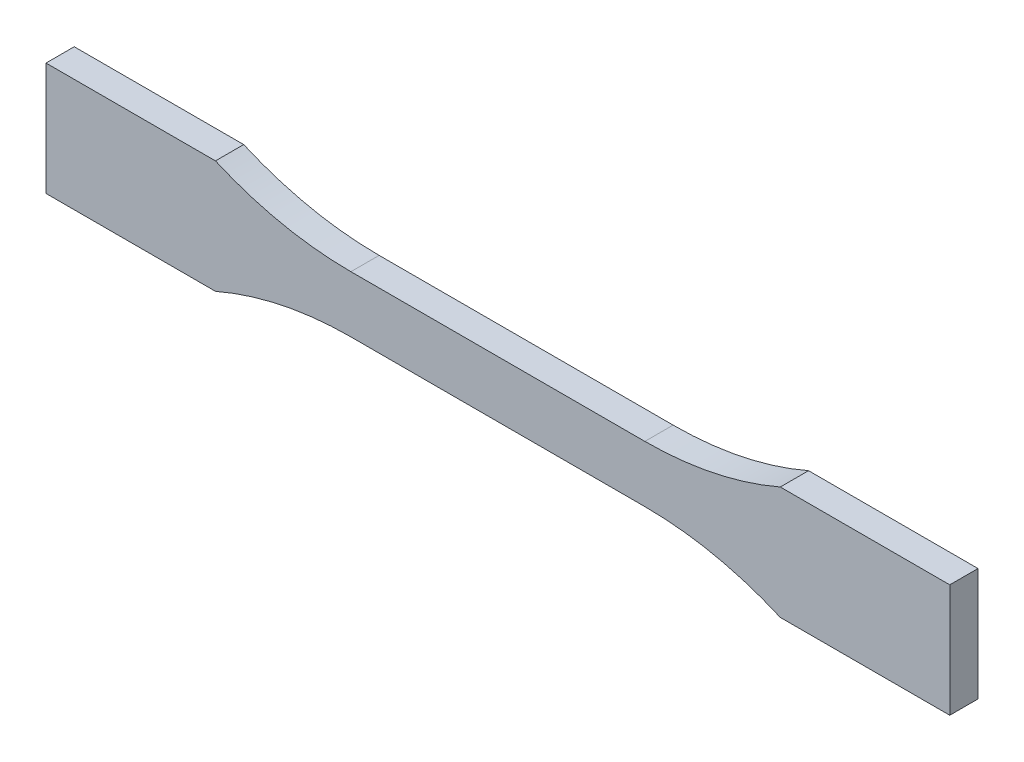
ISO-10303-21;
HEADER;
FILE_DESCRIPTION(('STEP AP214'),'2;1');
FILE_NAME('part.step','',(''),(''),'','','');
FILE_SCHEMA(('AUTOMOTIVE_DESIGN { 1 0 10303 214 1 1 1 1 }'));
ENDSEC;
DATA;
#1=APPLICATION_CONTEXT('core data for automotive mechanical design processes');
#2=APPLICATION_PROTOCOL_DEFINITION('international standard','automotive_design',2000,#1);
#3=PRODUCT_CONTEXT('',#1,'mechanical');
#4=PRODUCT('Part','Part','',(#3));
#5=PRODUCT_RELATED_PRODUCT_CATEGORY('part','',(#4));
#6=PRODUCT_DEFINITION_FORMATION('','',#4);
#7=PRODUCT_DEFINITION_CONTEXT('part definition',#1,'design');
#8=PRODUCT_DEFINITION('design','',#6,#7);
#9=PRODUCT_DEFINITION_SHAPE('','',#8);
#10=(LENGTH_UNIT() NAMED_UNIT(*) SI_UNIT(.MILLI.,.METRE.));
#11=(NAMED_UNIT(*) PLANE_ANGLE_UNIT() SI_UNIT($,.RADIAN.));
#12=(NAMED_UNIT(*) SI_UNIT($,.STERADIAN.) SOLID_ANGLE_UNIT());
#13=UNCERTAINTY_MEASURE_WITH_UNIT(LENGTH_MEASURE(1.E-05),#10,'distance_accuracy_value','');
#14=(GEOMETRIC_REPRESENTATION_CONTEXT(3) GLOBAL_UNCERTAINTY_ASSIGNED_CONTEXT((#13)) GLOBAL_UNIT_ASSIGNED_CONTEXT((#10,
#11,#12)) REPRESENTATION_CONTEXT('',''));
#15=CARTESIAN_POINT('',(0.,0.,0.));
#16=DIRECTION('',(0.,0.,1.));
#17=DIRECTION('',(1.,0.,0.));
#18=AXIS2_PLACEMENT_3D('',#15,#16,#17);
#19=CARTESIAN_POINT('',(-63.5,12.7,3.175));
#20=DIRECTION('',(0.,-1.,0.));
#21=DIRECTION('',(1.,0.,0.));
#22=AXIS2_PLACEMENT_3D('',#19,#20,#21);
#23=PLANE('',#22);
#24=DIRECTION('',(-1.,0.,0.));
#25=VECTOR('',#24,1.);
#26=CARTESIAN_POINT('',(-63.5,12.7,-3.175));
#27=LINE('',#26,#25);
#28=CARTESIAN_POINT('',(-63.5,12.7,-3.175));
#29=VERTEX_POINT('',#28);
#30=CARTESIAN_POINT('',(-101.6,12.7,-3.175));
#31=VERTEX_POINT('',#30);
#32=EDGE_CURVE('E170',#29,#31,#27,.T.);
#33=ORIENTED_EDGE('',*,*,#32,.T.);
#34=DIRECTION('',(0.,0.,-1.));
#35=VECTOR('',#34,1.);
#36=CARTESIAN_POINT('',(-101.6,12.7,3.175));
#37=LINE('',#36,#35);
#38=CARTESIAN_POINT('',(-101.6,12.7,3.175));
#39=VERTEX_POINT('',#38);
#40=EDGE_CURVE('E136',#39,#31,#37,.T.);
#41=ORIENTED_EDGE('',*,*,#40,.F.);
#42=DIRECTION('',(-1.,0.,0.));
#43=VECTOR('',#42,1.);
#44=CARTESIAN_POINT('',(-63.5,12.7,3.175));
#45=LINE('',#44,#43);
#46=CARTESIAN_POINT('',(-63.5,12.7,3.175));
#47=VERTEX_POINT('',#46);
#48=EDGE_CURVE('E127',#47,#39,#45,.T.);
#49=ORIENTED_EDGE('',*,*,#48,.F.);
#50=DIRECTION('',(0.,0.,-1.));
#51=VECTOR('',#50,1.);
#52=CARTESIAN_POINT('',(-63.5,12.7,3.175));
#53=LINE('',#52,#51);
#54=EDGE_CURVE('E134',#47,#29,#53,.T.);
#55=ORIENTED_EDGE('',*,*,#54,.T.);
#56=EDGE_LOOP('',(#33,#41,#49,#55));
#57=FACE_BOUND('',#56,.T.);
#58=ADVANCED_FACE('F38',(#57),#23,.F.);
#59=CARTESIAN_POINT('',(-101.6,12.7,3.175));
#60=DIRECTION('',(1.,0.,0.));
#61=DIRECTION('',(0.,0.,-1.));
#62=AXIS2_PLACEMENT_3D('',#59,#60,#61);
#63=PLANE('',#62);
#64=DIRECTION('',(0.,-1.,0.));
#65=VECTOR('',#64,1.);
#66=CARTESIAN_POINT('',(-101.6,12.7,-3.175));
#67=LINE('',#66,#65);
#68=CARTESIAN_POINT('',(-101.6,-12.7,-3.175));
#69=VERTEX_POINT('',#68);
#70=EDGE_CURVE('E205',#31,#69,#67,.T.);
#71=ORIENTED_EDGE('',*,*,#70,.T.);
#72=DIRECTION('',(0.,0.,-1.));
#73=VECTOR('',#72,1.);
#74=CARTESIAN_POINT('',(-101.6,-12.7,3.175));
#75=LINE('',#74,#73);
#76=CARTESIAN_POINT('',(-101.6,-12.7,3.175));
#77=VERTEX_POINT('',#76);
#78=EDGE_CURVE('E147',#77,#69,#75,.T.);
#79=ORIENTED_EDGE('',*,*,#78,.F.);
#80=DIRECTION('',(0.,-1.,0.));
#81=VECTOR('',#80,1.);
#82=CARTESIAN_POINT('',(-101.6,12.7,3.175));
#83=LINE('',#82,#81);
#84=EDGE_CURVE('E138',#39,#77,#83,.T.);
#85=ORIENTED_EDGE('',*,*,#84,.F.);
#86=ORIENTED_EDGE('',*,*,#40,.T.);
#87=EDGE_LOOP('',(#71,#79,#85,#86));
#88=FACE_BOUND('',#87,.T.);
#89=ADVANCED_FACE('F242',(#88),#63,.F.);
#90=CARTESIAN_POINT('',(-101.6,-12.7,3.175));
#91=DIRECTION('',(0.,1.,0.));
#92=DIRECTION('',(0.,0.,1.));
#93=AXIS2_PLACEMENT_3D('',#90,#91,#92);
#94=PLANE('',#93);
#95=DIRECTION('',(1.,0.,0.));
#96=VECTOR('',#95,1.);
#97=CARTESIAN_POINT('',(-101.6,-12.7,-3.175));
#98=LINE('',#97,#96);
#99=CARTESIAN_POINT('',(-63.5,-12.7,-3.175));
#100=VERTEX_POINT('',#99);
#101=EDGE_CURVE('E202',#69,#100,#98,.T.);
#102=ORIENTED_EDGE('',*,*,#101,.T.);
#103=DIRECTION('',(0.,0.,-1.));
#104=VECTOR('',#103,1.);
#105=CARTESIAN_POINT('',(-63.5,-12.7,3.175));
#106=LINE('',#105,#104);
#107=CARTESIAN_POINT('',(-63.5,-12.7,3.175));
#108=VERTEX_POINT('',#107);
#109=EDGE_CURVE('E192',#108,#100,#106,.T.);
#110=ORIENTED_EDGE('',*,*,#109,.F.);
#111=DIRECTION('',(1.,0.,0.));
#112=VECTOR('',#111,1.);
#113=CARTESIAN_POINT('',(-101.6,-12.7,3.175));
#114=LINE('',#113,#112);
#115=EDGE_CURVE('E203',#77,#108,#114,.T.);
#116=ORIENTED_EDGE('',*,*,#115,.F.);
#117=ORIENTED_EDGE('',*,*,#78,.T.);
#118=EDGE_LOOP('',(#102,#110,#116,#117));
#119=FACE_BOUND('',#118,.T.);
#120=ADVANCED_FACE('F200',(#119),#94,.F.);
#121=CARTESIAN_POINT('',(-63.5,-6.35,3.175));
#122=DIRECTION('',(0.,1.,0.));
#123=DIRECTION('',(-1.,0.,0.));
#124=AXIS2_PLACEMENT_3D('',#121,#122,#123);
#125=PLANE('',#124);
#126=DIRECTION('',(1.,0.,0.));
#127=VECTOR('',#126,1.);
#128=CARTESIAN_POINT('',(-63.5,-6.35,-3.175));
#129=LINE('',#128,#127);
#130=CARTESIAN_POINT('',(-33.0464698269642,-6.34999999999999,-3.175));
#131=VERTEX_POINT('',#130);
#132=CARTESIAN_POINT('',(33.0464698269642,-6.34999999999998,-3.175));
#133=VERTEX_POINT('',#132);
#134=EDGE_CURVE('E207',#131,#133,#129,.T.);
#135=ORIENTED_EDGE('',*,*,#134,.T.);
#136=DIRECTION('',(0.,0.,1.));
#137=VECTOR('',#136,1.);
#138=CARTESIAN_POINT('',(33.0464698269642,-6.34999999999998,3.175));
#139=LINE('',#138,#137);
#140=CARTESIAN_POINT('',(33.0464698269642,-6.34999999999998,3.175));
#141=VERTEX_POINT('',#140);
#142=EDGE_CURVE('E145',#133,#141,#139,.T.);
#143=ORIENTED_EDGE('',*,*,#142,.T.);
#144=DIRECTION('',(1.,0.,0.));
#145=VECTOR('',#144,1.);
#146=CARTESIAN_POINT('',(-63.5,-6.35,3.175));
#147=LINE('',#146,#145);
#148=CARTESIAN_POINT('',(-33.0464698269642,-6.34999999999999,3.175));
#149=VERTEX_POINT('',#148);
#150=EDGE_CURVE('E385',#149,#141,#147,.T.);
#151=ORIENTED_EDGE('',*,*,#150,.F.);
#152=DIRECTION('',(0.,0.,-1.));
#153=VECTOR('',#152,1.);
#154=CARTESIAN_POINT('',(-33.0464698269642,-6.34999999999999,3.175));
#155=LINE('',#154,#153);
#156=EDGE_CURVE('E142',#149,#131,#155,.T.);
#157=ORIENTED_EDGE('',*,*,#156,.T.);
#158=EDGE_LOOP('',(#135,#143,#151,#157));
#159=FACE_BOUND('',#158,.T.);
#160=ADVANCED_FACE('F251',(#159),#125,.F.);
#161=CARTESIAN_POINT('',(101.6,-12.7,3.175));
#162=DIRECTION('',(0.,1.,0.));
#163=DIRECTION('',(-1.,0.,0.));
#164=AXIS2_PLACEMENT_3D('',#161,#162,#163);
#165=PLANE('',#164);
#166=DIRECTION('',(1.,0.,0.));
#167=VECTOR('',#166,1.);
#168=CARTESIAN_POINT('',(101.6,-12.7,-3.175));
#169=LINE('',#168,#167);
#170=CARTESIAN_POINT('',(63.5,-12.7,-3.175));
#171=VERTEX_POINT('',#170);
#172=CARTESIAN_POINT('',(101.6,-12.7,-3.175));
#173=VERTEX_POINT('',#172);
#174=EDGE_CURVE('E210',#171,#173,#169,.T.);
#175=ORIENTED_EDGE('',*,*,#174,.T.);
#176=DIRECTION('',(0.,0.,-1.));
#177=VECTOR('',#176,1.);
#178=CARTESIAN_POINT('',(101.6,-12.7,3.175));
#179=LINE('',#178,#177);
#180=CARTESIAN_POINT('',(101.6,-12.7,3.175));
#181=VERTEX_POINT('',#180);
#182=EDGE_CURVE('E186',#181,#173,#179,.T.);
#183=ORIENTED_EDGE('',*,*,#182,.F.);
#184=DIRECTION('',(1.,0.,0.));
#185=VECTOR('',#184,1.);
#186=CARTESIAN_POINT('',(101.6,-12.7,3.175));
#187=LINE('',#186,#185);
#188=CARTESIAN_POINT('',(63.5,-12.7,3.175));
#189=VERTEX_POINT('',#188);
#190=EDGE_CURVE('E384',#189,#181,#187,.T.);
#191=ORIENTED_EDGE('',*,*,#190,.F.);
#192=DIRECTION('',(0.,0.,-1.));
#193=VECTOR('',#192,1.);
#194=CARTESIAN_POINT('',(63.5,-12.7,3.175));
#195=LINE('',#194,#193);
#196=EDGE_CURVE('E189',#189,#171,#195,.T.);
#197=ORIENTED_EDGE('',*,*,#196,.T.);
#198=EDGE_LOOP('',(#175,#183,#191,#197));
#199=FACE_BOUND('',#198,.T.);
#200=ADVANCED_FACE('F254',(#199),#165,.F.);
#201=CARTESIAN_POINT('',(101.6,12.7,3.175));
#202=DIRECTION('',(-1.,0.,0.));
#203=DIRECTION('',(0.,0.,1.));
#204=AXIS2_PLACEMENT_3D('',#201,#202,#203);
#205=PLANE('',#204);
#206=DIRECTION('',(0.,1.,0.));
#207=VECTOR('',#206,1.);
#208=CARTESIAN_POINT('',(101.6,12.7,-3.175));
#209=LINE('',#208,#207);
#210=CARTESIAN_POINT('',(101.6,12.7,-3.175));
#211=VERTEX_POINT('',#210);
#212=EDGE_CURVE('E176',#173,#211,#209,.T.);
#213=ORIENTED_EDGE('',*,*,#212,.T.);
#214=DIRECTION('',(0.,0.,-1.));
#215=VECTOR('',#214,1.);
#216=CARTESIAN_POINT('',(101.6,12.7,3.175));
#217=LINE('',#216,#215);
#218=CARTESIAN_POINT('',(101.6,12.7,3.175));
#219=VERTEX_POINT('',#218);
#220=EDGE_CURVE('E183',#219,#211,#217,.T.);
#221=ORIENTED_EDGE('',*,*,#220,.F.);
#222=DIRECTION('',(0.,1.,0.));
#223=VECTOR('',#222,1.);
#224=CARTESIAN_POINT('',(101.6,12.7,3.175));
#225=LINE('',#224,#223);
#226=EDGE_CURVE('E386',#181,#219,#225,.T.);
#227=ORIENTED_EDGE('',*,*,#226,.F.);
#228=ORIENTED_EDGE('',*,*,#182,.T.);
#229=EDGE_LOOP('',(#213,#221,#227,#228));
#230=FACE_BOUND('',#229,.T.);
#231=ADVANCED_FACE('F218',(#230),#205,.F.);
#232=CARTESIAN_POINT('',(63.5,12.7,3.175));
#233=DIRECTION('',(0.,-1.,0.));
#234=DIRECTION('',(1.,0.,0.));
#235=AXIS2_PLACEMENT_3D('',#232,#233,#234);
#236=PLANE('',#235);
#237=DIRECTION('',(-1.,0.,0.));
#238=VECTOR('',#237,1.);
#239=CARTESIAN_POINT('',(63.5,12.7,-3.175));
#240=LINE('',#239,#238);
#241=CARTESIAN_POINT('',(63.5,12.7,-3.175));
#242=VERTEX_POINT('',#241);
#243=EDGE_CURVE('E173',#211,#242,#240,.T.);
#244=ORIENTED_EDGE('',*,*,#243,.T.);
#245=DIRECTION('',(0.,0.,-1.));
#246=VECTOR('',#245,1.);
#247=CARTESIAN_POINT('',(63.5,12.7,3.175));
#248=LINE('',#247,#246);
#249=CARTESIAN_POINT('',(63.5,12.7,3.175));
#250=VERTEX_POINT('',#249);
#251=EDGE_CURVE('E180',#250,#242,#248,.T.);
#252=ORIENTED_EDGE('',*,*,#251,.F.);
#253=DIRECTION('',(-1.,0.,0.));
#254=VECTOR('',#253,1.);
#255=CARTESIAN_POINT('',(63.5,12.7,3.175));
#256=LINE('',#255,#254);
#257=EDGE_CURVE('E227',#219,#250,#256,.T.);
#258=ORIENTED_EDGE('',*,*,#257,.F.);
#259=ORIENTED_EDGE('',*,*,#220,.T.);
#260=EDGE_LOOP('',(#244,#252,#258,#259));
#261=FACE_BOUND('',#260,.T.);
#262=ADVANCED_FACE('F225',(#261),#236,.F.);
#263=CARTESIAN_POINT('',(-63.5,6.35,3.175));
#264=DIRECTION('',(0.,-1.,0.));
#265=DIRECTION('',(0.,0.,-1.));
#266=AXIS2_PLACEMENT_3D('',#263,#264,#265);
#267=PLANE('',#266);
#268=DIRECTION('',(-1.,0.,0.));
#269=VECTOR('',#268,1.);
#270=CARTESIAN_POINT('',(-63.5,6.35,3.175));
#271=LINE('',#270,#269);
#272=CARTESIAN_POINT('',(33.0464698269642,6.35,3.175));
#273=VERTEX_POINT('',#272);
#274=CARTESIAN_POINT('',(-33.0464698269642,6.35,3.175));
#275=VERTEX_POINT('',#274);
#276=EDGE_CURVE('E129',#273,#275,#271,.T.);
#277=ORIENTED_EDGE('',*,*,#276,.F.);
#278=DIRECTION('',(0.,0.,-1.));
#279=VECTOR('',#278,1.);
#280=CARTESIAN_POINT('',(33.0464698269642,6.35,3.175));
#281=LINE('',#280,#279);
#282=CARTESIAN_POINT('',(33.0464698269642,6.35,-3.175));
#283=VERTEX_POINT('',#282);
#284=EDGE_CURVE('E153',#273,#283,#281,.T.);
#285=ORIENTED_EDGE('',*,*,#284,.T.);
#286=DIRECTION('',(-1.,0.,0.));
#287=VECTOR('',#286,1.);
#288=CARTESIAN_POINT('',(-63.5,6.35,-3.175));
#289=LINE('',#288,#287);
#290=CARTESIAN_POINT('',(-33.0464698269642,6.35,-3.175));
#291=VERTEX_POINT('',#290);
#292=EDGE_CURVE('E139',#283,#291,#289,.T.);
#293=ORIENTED_EDGE('',*,*,#292,.T.);
#294=DIRECTION('',(0.,0.,1.));
#295=VECTOR('',#294,1.);
#296=CARTESIAN_POINT('',(-33.0464698269642,6.35,3.175));
#297=LINE('',#296,#295);
#298=EDGE_CURVE('E53',#291,#275,#297,.T.);
#299=ORIENTED_EDGE('',*,*,#298,.T.);
#300=EDGE_LOOP('',(#277,#285,#293,#299));
#301=FACE_BOUND('',#300,.T.);
#302=ADVANCED_FACE('F171',(#301),#267,.F.);
#303=CARTESIAN_POINT('',(0.,0.,3.175));
#304=DIRECTION('',(0.,0.,1.));
#305=DIRECTION('',(1.,0.,0.));
#306=AXIS2_PLACEMENT_3D('',#303,#304,#305);
#307=PLANE('',#306);
#308=ORIENTED_EDGE('',*,*,#276,.T.);
#309=CARTESIAN_POINT('',(-33.0464698269642,82.55,3.175));
#310=DIRECTION('',(0.,0.,1.));
#311=DIRECTION('',(1.,0.,0.));
#312=AXIS2_PLACEMENT_3D('',#309,#310,#311);
#313=CIRCLE('',#312,76.2);
#314=EDGE_CURVE('E11',#275,#47,#313,.F.);
#315=ORIENTED_EDGE('',*,*,#314,.T.);
#316=ORIENTED_EDGE('',*,*,#48,.T.);
#317=ORIENTED_EDGE('',*,*,#84,.T.);
#318=ORIENTED_EDGE('',*,*,#115,.T.);
#319=CARTESIAN_POINT('',(-33.0464698269642,-82.55,3.175));
#320=DIRECTION('',(0.,0.,1.));
#321=DIRECTION('',(1.,0.,0.));
#322=AXIS2_PLACEMENT_3D('',#319,#320,#321);
#323=CIRCLE('',#322,76.2);
#324=EDGE_CURVE('E165',#108,#149,#323,.F.);
#325=ORIENTED_EDGE('',*,*,#324,.T.);
#326=ORIENTED_EDGE('',*,*,#150,.T.);
#327=CARTESIAN_POINT('',(33.0464698269642,-82.55,3.175));
#328=DIRECTION('',(0.,0.,1.));
#329=DIRECTION('',(1.,0.,0.));
#330=AXIS2_PLACEMENT_3D('',#327,#328,#329);
#331=CIRCLE('',#330,76.2);
#332=EDGE_CURVE('E158',#141,#189,#331,.F.);
#333=ORIENTED_EDGE('',*,*,#332,.T.);
#334=ORIENTED_EDGE('',*,*,#190,.T.);
#335=ORIENTED_EDGE('',*,*,#226,.T.);
#336=ORIENTED_EDGE('',*,*,#257,.T.);
#337=CARTESIAN_POINT('',(33.0464698269642,82.55,3.175));
#338=DIRECTION('',(0.,0.,1.));
#339=DIRECTION('',(1.,0.,0.));
#340=AXIS2_PLACEMENT_3D('',#337,#338,#339);
#341=CIRCLE('',#340,76.2);
#342=EDGE_CURVE('E60',#250,#273,#341,.F.);
#343=ORIENTED_EDGE('',*,*,#342,.T.);
#344=EDGE_LOOP('',(#308,#315,#316,#317,#318,#325,#326,#333,#334,#335,#336,#343));
#345=FACE_BOUND('',#344,.T.);
#346=ADVANCED_FACE('F126',(#345),#307,.T.);
#347=CARTESIAN_POINT('',(0.,0.,-3.175));
#348=DIRECTION('',(0.,0.,1.));
#349=DIRECTION('',(1.,0.,0.));
#350=AXIS2_PLACEMENT_3D('',#347,#348,#349);
#351=PLANE('',#350);
#352=ORIENTED_EDGE('',*,*,#32,.F.);
#353=CARTESIAN_POINT('',(-33.0464698269642,82.55,-3.175));
#354=DIRECTION('',(0.,0.,1.));
#355=DIRECTION('',(1.,0.,0.));
#356=AXIS2_PLACEMENT_3D('',#353,#354,#355);
#357=CIRCLE('',#356,76.2);
#358=EDGE_CURVE('E46',#29,#291,#357,.T.);
#359=ORIENTED_EDGE('',*,*,#358,.T.);
#360=ORIENTED_EDGE('',*,*,#292,.F.);
#361=CARTESIAN_POINT('',(33.0464698269642,82.55,-3.175));
#362=DIRECTION('',(0.,0.,1.));
#363=DIRECTION('',(1.,0.,0.));
#364=AXIS2_PLACEMENT_3D('',#361,#362,#363);
#365=CIRCLE('',#364,76.2);
#366=EDGE_CURVE('E160',#283,#242,#365,.T.);
#367=ORIENTED_EDGE('',*,*,#366,.T.);
#368=ORIENTED_EDGE('',*,*,#243,.F.);
#369=ORIENTED_EDGE('',*,*,#212,.F.);
#370=ORIENTED_EDGE('',*,*,#174,.F.);
#371=CARTESIAN_POINT('',(33.0464698269642,-82.55,-3.175));
#372=DIRECTION('',(0.,0.,1.));
#373=DIRECTION('',(1.,0.,0.));
#374=AXIS2_PLACEMENT_3D('',#371,#372,#373);
#375=CIRCLE('',#374,76.2);
#376=EDGE_CURVE('E156',#171,#133,#375,.T.);
#377=ORIENTED_EDGE('',*,*,#376,.T.);
#378=ORIENTED_EDGE('',*,*,#134,.F.);
#379=CARTESIAN_POINT('',(-33.0464698269642,-82.55,-3.175));
#380=DIRECTION('',(0.,0.,1.));
#381=DIRECTION('',(1.,0.,0.));
#382=AXIS2_PLACEMENT_3D('',#379,#380,#381);
#383=CIRCLE('',#382,76.2);
#384=EDGE_CURVE('E163',#131,#100,#383,.T.);
#385=ORIENTED_EDGE('',*,*,#384,.T.);
#386=ORIENTED_EDGE('',*,*,#101,.F.);
#387=ORIENTED_EDGE('',*,*,#70,.F.);
#388=EDGE_LOOP('',(#352,#359,#360,#367,#368,#369,#370,#377,#378,#385,#386,#387));
#389=FACE_BOUND('',#388,.T.);
#390=ADVANCED_FACE('F168',(#389),#351,.F.);
#391=CARTESIAN_POINT('',(33.0464698269642,-82.55,3.175));
#392=DIRECTION('',(0.,0.,1.));
#393=DIRECTION('',(1.,0.,0.));
#394=AXIS2_PLACEMENT_3D('',#391,#392,#393);
#395=CYLINDRICAL_SURFACE('',#394,76.2);
#396=ORIENTED_EDGE('',*,*,#332,.F.);
#397=ORIENTED_EDGE('',*,*,#142,.F.);
#398=ORIENTED_EDGE('',*,*,#376,.F.);
#399=ORIENTED_EDGE('',*,*,#196,.F.);
#400=EDGE_LOOP('',(#396,#397,#398,#399));
#401=FACE_BOUND('',#400,.T.);
#402=ADVANCED_FACE('F232',(#401),#395,.F.);
#403=CARTESIAN_POINT('',(33.0464698269642,82.55,3.175));
#404=DIRECTION('',(0.,0.,-1.));
#405=DIRECTION('',(-1.,0.,0.));
#406=AXIS2_PLACEMENT_3D('',#403,#404,#405);
#407=CYLINDRICAL_SURFACE('',#406,76.2);
#408=ORIENTED_EDGE('',*,*,#342,.F.);
#409=ORIENTED_EDGE('',*,*,#251,.T.);
#410=ORIENTED_EDGE('',*,*,#366,.F.);
#411=ORIENTED_EDGE('',*,*,#284,.F.);
#412=EDGE_LOOP('',(#408,#409,#410,#411));
#413=FACE_BOUND('',#412,.T.);
#414=ADVANCED_FACE('F229',(#413),#407,.F.);
#415=CARTESIAN_POINT('',(-33.0464698269642,-82.55,3.175));
#416=DIRECTION('',(0.,0.,-1.));
#417=DIRECTION('',(-1.,0.,0.));
#418=AXIS2_PLACEMENT_3D('',#415,#416,#417);
#419=CYLINDRICAL_SURFACE('',#418,76.2);
#420=ORIENTED_EDGE('',*,*,#324,.F.);
#421=ORIENTED_EDGE('',*,*,#109,.T.);
#422=ORIENTED_EDGE('',*,*,#384,.F.);
#423=ORIENTED_EDGE('',*,*,#156,.F.);
#424=EDGE_LOOP('',(#420,#421,#422,#423));
#425=FACE_BOUND('',#424,.T.);
#426=ADVANCED_FACE('F231',(#425),#419,.F.);
#427=CARTESIAN_POINT('',(-33.0464698269642,82.55,3.175));
#428=DIRECTION('',(0.,0.,1.));
#429=DIRECTION('',(1.,0.,0.));
#430=AXIS2_PLACEMENT_3D('',#427,#428,#429);
#431=CYLINDRICAL_SURFACE('',#430,76.2);
#432=ORIENTED_EDGE('',*,*,#314,.F.);
#433=ORIENTED_EDGE('',*,*,#298,.F.);
#434=ORIENTED_EDGE('',*,*,#358,.F.);
#435=ORIENTED_EDGE('',*,*,#54,.F.);
#436=EDGE_LOOP('',(#432,#433,#434,#435));
#437=FACE_BOUND('',#436,.T.);
#438=ADVANCED_FACE('F40',(#437),#431,.F.);
#439=CLOSED_SHELL('',(#58,#89,#120,#160,#200,#231,#262,#302,#346,#390,#402,#414,#426,#438));
#440=MANIFOLD_SOLID_BREP('B2',#439);
#441=ADVANCED_BREP_SHAPE_REPRESENTATION('',(#18,#440),#14);
#442=SHAPE_DEFINITION_REPRESENTATION(#9,#441);
ENDSEC;
END-ISO-10303-21;
